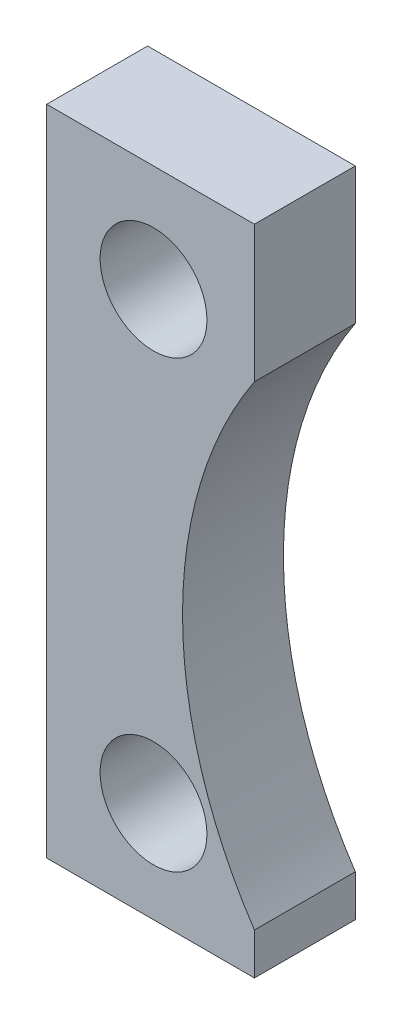
ISO-10303-21;
HEADER;
FILE_DESCRIPTION(('STEP AP214'),'2;1');
FILE_NAME('part.step','',(''),(''),'','','');
FILE_SCHEMA(('AUTOMOTIVE_DESIGN { 1 0 10303 214 1 1 1 1 }'));
ENDSEC;
DATA;
#1=APPLICATION_CONTEXT('core data for automotive mechanical design processes');
#2=APPLICATION_PROTOCOL_DEFINITION('international standard','automotive_design',2000,#1);
#3=PRODUCT_CONTEXT('',#1,'mechanical');
#4=PRODUCT('Part','Part','',(#3));
#5=PRODUCT_RELATED_PRODUCT_CATEGORY('part','',(#4));
#6=PRODUCT_DEFINITION_FORMATION('','',#4);
#7=PRODUCT_DEFINITION_CONTEXT('part definition',#1,'design');
#8=PRODUCT_DEFINITION('design','',#6,#7);
#9=PRODUCT_DEFINITION_SHAPE('','',#8);
#10=(LENGTH_UNIT() NAMED_UNIT(*) SI_UNIT(.MILLI.,.METRE.));
#11=(NAMED_UNIT(*) PLANE_ANGLE_UNIT() SI_UNIT($,.RADIAN.));
#12=(NAMED_UNIT(*) SI_UNIT($,.STERADIAN.) SOLID_ANGLE_UNIT());
#13=UNCERTAINTY_MEASURE_WITH_UNIT(LENGTH_MEASURE(1.E-05),#10,'distance_accuracy_value','');
#14=(GEOMETRIC_REPRESENTATION_CONTEXT(3) GLOBAL_UNCERTAINTY_ASSIGNED_CONTEXT((#13)) GLOBAL_UNIT_ASSIGNED_CONTEXT((#10,
#11,#12)) REPRESENTATION_CONTEXT('',''));
#15=CARTESIAN_POINT('',(0.,0.,0.));
#16=DIRECTION('',(0.,0.,1.));
#17=DIRECTION('',(1.,0.,0.));
#18=AXIS2_PLACEMENT_3D('',#15,#16,#17);
#19=CARTESIAN_POINT('',(0.,110.,8.5));
#20=DIRECTION('',(1.,0.,0.));
#21=DIRECTION('',(0.,1.,0.));
#22=AXIS2_PLACEMENT_3D('',#19,#20,#21);
#23=PLANE('',#22);
#24=DIRECTION('',(0.,-1.,0.));
#25=VECTOR('',#24,1.);
#26=CARTESIAN_POINT('',(0.,110.,-8.5));
#27=LINE('',#26,#25);
#28=CARTESIAN_POINT('',(0.,110.,-8.5));
#29=VERTEX_POINT('',#28);
#30=CARTESIAN_POINT('',(0.,0.,-8.5));
#31=VERTEX_POINT('',#30);
#32=EDGE_CURVE('E122',#29,#31,#27,.T.);
#33=ORIENTED_EDGE('',*,*,#32,.T.);
#34=DIRECTION('',(0.,0.,-1.));
#35=VECTOR('',#34,1.);
#36=CARTESIAN_POINT('',(0.,0.,8.5));
#37=LINE('',#36,#35);
#38=CARTESIAN_POINT('',(0.,0.,8.5));
#39=VERTEX_POINT('',#38);
#40=EDGE_CURVE('E11',#39,#31,#37,.T.);
#41=ORIENTED_EDGE('',*,*,#40,.F.);
#42=DIRECTION('',(0.,-1.,0.));
#43=VECTOR('',#42,1.);
#44=CARTESIAN_POINT('',(0.,110.,8.5));
#45=LINE('',#44,#43);
#46=CARTESIAN_POINT('',(0.,110.,8.5));
#47=VERTEX_POINT('',#46);
#48=EDGE_CURVE('E133',#47,#39,#45,.T.);
#49=ORIENTED_EDGE('',*,*,#48,.F.);
#50=DIRECTION('',(0.,0.,-1.));
#51=VECTOR('',#50,1.);
#52=CARTESIAN_POINT('',(0.,110.,8.5));
#53=LINE('',#52,#51);
#54=EDGE_CURVE('E118',#47,#29,#53,.T.);
#55=ORIENTED_EDGE('',*,*,#54,.T.);
#56=EDGE_LOOP('',(#33,#41,#49,#55));
#57=FACE_BOUND('',#56,.T.);
#58=ADVANCED_FACE('F38',(#57),#23,.F.);
#59=CARTESIAN_POINT('',(0.,0.,8.5));
#60=DIRECTION('',(0.,1.,0.));
#61=DIRECTION('',(0.,0.,1.));
#62=AXIS2_PLACEMENT_3D('',#59,#60,#61);
#63=PLANE('',#62);
#64=DIRECTION('',(1.,0.,0.));
#65=VECTOR('',#64,1.);
#66=CARTESIAN_POINT('',(0.,0.,-8.5));
#67=LINE('',#66,#65);
#68=CARTESIAN_POINT('',(35.,0.,-8.5));
#69=VERTEX_POINT('',#68);
#70=EDGE_CURVE('E125',#31,#69,#67,.T.);
#71=ORIENTED_EDGE('',*,*,#70,.T.);
#72=DIRECTION('',(0.,0.,-1.));
#73=VECTOR('',#72,1.);
#74=CARTESIAN_POINT('',(35.,0.,8.5));
#75=LINE('',#74,#73);
#76=CARTESIAN_POINT('',(35.,0.,8.5));
#77=VERTEX_POINT('',#76);
#78=EDGE_CURVE('E46',#77,#69,#75,.T.);
#79=ORIENTED_EDGE('',*,*,#78,.F.);
#80=DIRECTION('',(1.,0.,0.));
#81=VECTOR('',#80,1.);
#82=CARTESIAN_POINT('',(0.,0.,8.5));
#83=LINE('',#82,#81);
#84=EDGE_CURVE('E91',#39,#77,#83,.T.);
#85=ORIENTED_EDGE('',*,*,#84,.F.);
#86=ORIENTED_EDGE('',*,*,#40,.T.);
#87=EDGE_LOOP('',(#71,#79,#85,#86));
#88=FACE_BOUND('',#87,.T.);
#89=ADVANCED_FACE('F159',(#88),#63,.F.);
#90=CARTESIAN_POINT('',(35.,7.,8.5));
#91=DIRECTION('',(-1.,0.,0.));
#92=DIRECTION('',(0.,-1.,0.));
#93=AXIS2_PLACEMENT_3D('',#90,#91,#92);
#94=PLANE('',#93);
#95=DIRECTION('',(0.,1.,0.));
#96=VECTOR('',#95,1.);
#97=CARTESIAN_POINT('',(35.,7.,-8.5));
#98=LINE('',#97,#96);
#99=CARTESIAN_POINT('',(35.,7.00000000000003,-8.5));
#100=VERTEX_POINT('',#99);
#101=EDGE_CURVE('E128',#69,#100,#98,.T.);
#102=ORIENTED_EDGE('',*,*,#101,.T.);
#103=DIRECTION('',(0.,0.,-1.));
#104=VECTOR('',#103,1.);
#105=CARTESIAN_POINT('',(35.,7.00000000000003,8.5));
#106=LINE('',#105,#104);
#107=CARTESIAN_POINT('',(35.,7.00000000000003,8.5));
#108=VERTEX_POINT('',#107);
#109=EDGE_CURVE('E113',#108,#100,#106,.T.);
#110=ORIENTED_EDGE('',*,*,#109,.F.);
#111=DIRECTION('',(0.,1.,0.));
#112=VECTOR('',#111,1.);
#113=CARTESIAN_POINT('',(35.,7.,8.5));
#114=LINE('',#113,#112);
#115=EDGE_CURVE('E104',#77,#108,#114,.T.);
#116=ORIENTED_EDGE('',*,*,#115,.F.);
#117=ORIENTED_EDGE('',*,*,#78,.T.);
#118=EDGE_LOOP('',(#102,#110,#116,#117));
#119=FACE_BOUND('',#118,.T.);
#120=ADVANCED_FACE('F139',(#119),#94,.F.);
#121=CARTESIAN_POINT('',(95.0000000000002,47.,8.5));
#122=DIRECTION('',(0.,0.,-1.));
#123=DIRECTION('',(-1.,0.,0.));
#124=AXIS2_PLACEMENT_3D('',#121,#122,#123);
#125=CYLINDRICAL_SURFACE('',#124,72.11102550928);
#126=CARTESIAN_POINT('',(95.0000000000002,47.,-8.5));
#127=DIRECTION('',(0.,0.,-1.));
#128=DIRECTION('',(1.,0.,0.));
#129=AXIS2_PLACEMENT_3D('',#126,#127,#128);
#130=CIRCLE('',#129,72.11102550928);
#131=CARTESIAN_POINT('',(35.,87.,-8.5));
#132=VERTEX_POINT('',#131);
#133=EDGE_CURVE('E112',#100,#132,#130,.T.);
#134=ORIENTED_EDGE('',*,*,#133,.T.);
#135=DIRECTION('',(0.,0.,-1.));
#136=VECTOR('',#135,1.);
#137=CARTESIAN_POINT('',(35.,87.,8.5));
#138=LINE('',#137,#136);
#139=CARTESIAN_POINT('',(35.,87.,8.5));
#140=VERTEX_POINT('',#139);
#141=EDGE_CURVE('E109',#140,#132,#138,.T.);
#142=ORIENTED_EDGE('',*,*,#141,.F.);
#143=CARTESIAN_POINT('',(95.0000000000002,47.,8.5));
#144=DIRECTION('',(0.,0.,-1.));
#145=DIRECTION('',(1.,0.,0.));
#146=AXIS2_PLACEMENT_3D('',#143,#144,#145);
#147=CIRCLE('',#146,72.11102550928);
#148=EDGE_CURVE('E98',#108,#140,#147,.T.);
#149=ORIENTED_EDGE('',*,*,#148,.F.);
#150=ORIENTED_EDGE('',*,*,#109,.T.);
#151=EDGE_LOOP('',(#134,#142,#149,#150));
#152=FACE_BOUND('',#151,.T.);
#153=ADVANCED_FACE('F110',(#152),#125,.F.);
#154=CARTESIAN_POINT('',(35.,110.,8.5));
#155=DIRECTION('',(-1.,0.,0.));
#156=DIRECTION('',(0.,0.,1.));
#157=AXIS2_PLACEMENT_3D('',#154,#155,#156);
#158=PLANE('',#157);
#159=DIRECTION('',(0.,1.,0.));
#160=VECTOR('',#159,1.);
#161=CARTESIAN_POINT('',(35.,110.,-8.5));
#162=LINE('',#161,#160);
#163=CARTESIAN_POINT('',(35.,110.,-8.5));
#164=VERTEX_POINT('',#163);
#165=EDGE_CURVE('E77',#132,#164,#162,.T.);
#166=ORIENTED_EDGE('',*,*,#165,.T.);
#167=DIRECTION('',(0.,0.,-1.));
#168=VECTOR('',#167,1.);
#169=CARTESIAN_POINT('',(35.,110.,8.5));
#170=LINE('',#169,#168);
#171=CARTESIAN_POINT('',(35.,110.,8.5));
#172=VERTEX_POINT('',#171);
#173=EDGE_CURVE('E114',#172,#164,#170,.T.);
#174=ORIENTED_EDGE('',*,*,#173,.F.);
#175=DIRECTION('',(0.,1.,0.));
#176=VECTOR('',#175,1.);
#177=CARTESIAN_POINT('',(35.,110.,8.5));
#178=LINE('',#177,#176);
#179=EDGE_CURVE('E102',#140,#172,#178,.T.);
#180=ORIENTED_EDGE('',*,*,#179,.F.);
#181=ORIENTED_EDGE('',*,*,#141,.T.);
#182=EDGE_LOOP('',(#166,#174,#180,#181));
#183=FACE_BOUND('',#182,.T.);
#184=ADVANCED_FACE('F116',(#183),#158,.F.);
#185=CARTESIAN_POINT('',(0.,110.,8.5));
#186=DIRECTION('',(0.,-1.,0.));
#187=DIRECTION('',(0.,0.,-1.));
#188=AXIS2_PLACEMENT_3D('',#185,#186,#187);
#189=PLANE('',#188);
#190=DIRECTION('',(-1.,0.,0.));
#191=VECTOR('',#190,1.);
#192=CARTESIAN_POINT('',(0.,110.,-8.5));
#193=LINE('',#192,#191);
#194=EDGE_CURVE('E83',#164,#29,#193,.T.);
#195=ORIENTED_EDGE('',*,*,#194,.T.);
#196=ORIENTED_EDGE('',*,*,#54,.F.);
#197=DIRECTION('',(-1.,0.,0.));
#198=VECTOR('',#197,1.);
#199=CARTESIAN_POINT('',(0.,110.,8.5));
#200=LINE('',#199,#198);
#201=EDGE_CURVE('E54',#172,#47,#200,.T.);
#202=ORIENTED_EDGE('',*,*,#201,.F.);
#203=ORIENTED_EDGE('',*,*,#173,.T.);
#204=EDGE_LOOP('',(#195,#196,#202,#203));
#205=FACE_BOUND('',#204,.T.);
#206=ADVANCED_FACE('F146',(#205),#189,.F.);
#207=CARTESIAN_POINT('',(95.0000000000002,47.,8.5));
#208=DIRECTION('',(0.,0.,1.));
#209=DIRECTION('',(1.,0.,0.));
#210=AXIS2_PLACEMENT_3D('',#207,#208,#209);
#211=PLANE('',#210);
#212=CARTESIAN_POINT('',(18.0000000000002,92.,8.5));
#213=DIRECTION('',(0.,0.,1.));
#214=DIRECTION('',(1.,0.,0.));
#215=AXIS2_PLACEMENT_3D('',#212,#213,#214);
#216=CIRCLE('',#215,9.00000000000001);
#217=CARTESIAN_POINT('',(27.0000000000002,92.,8.5));
#218=VERTEX_POINT('',#217);
#219=EDGE_CURVE('E219',#218,#218,#216,.T.);
#220=ORIENTED_EDGE('',*,*,#219,.F.);
#221=EDGE_LOOP('',(#220));
#222=FACE_BOUND('',#221,.T.);
#223=CARTESIAN_POINT('',(18.0000000000002,17.,8.5));
#224=DIRECTION('',(0.,0.,1.));
#225=DIRECTION('',(1.,0.,0.));
#226=AXIS2_PLACEMENT_3D('',#223,#224,#225);
#227=CIRCLE('',#226,9.);
#228=CARTESIAN_POINT('',(27.0000000000002,17.,8.5));
#229=VERTEX_POINT('',#228);
#230=EDGE_CURVE('E224',#229,#229,#227,.T.);
#231=ORIENTED_EDGE('',*,*,#230,.F.);
#232=EDGE_LOOP('',(#231));
#233=FACE_BOUND('',#232,.T.);
#234=ORIENTED_EDGE('',*,*,#48,.T.);
#235=ORIENTED_EDGE('',*,*,#84,.T.);
#236=ORIENTED_EDGE('',*,*,#115,.T.);
#237=ORIENTED_EDGE('',*,*,#148,.T.);
#238=ORIENTED_EDGE('',*,*,#179,.T.);
#239=ORIENTED_EDGE('',*,*,#201,.T.);
#240=EDGE_LOOP('',(#234,#235,#236,#237,#238,#239));
#241=FACE_BOUND('',#240,.T.);
#242=ADVANCED_FACE('F100',(#222,#233,#241),#211,.T.);
#243=CARTESIAN_POINT('',(95.0000000000002,47.,-8.5));
#244=DIRECTION('',(0.,0.,1.));
#245=DIRECTION('',(1.,0.,0.));
#246=AXIS2_PLACEMENT_3D('',#243,#244,#245);
#247=PLANE('',#246);
#248=CARTESIAN_POINT('',(18.0000000000002,92.,-8.5));
#249=DIRECTION('',(0.,0.,1.));
#250=DIRECTION('',(1.,0.,0.));
#251=AXIS2_PLACEMENT_3D('',#248,#249,#250);
#252=CIRCLE('',#251,9.00000000000001);
#253=CARTESIAN_POINT('',(27.0000000000002,92.,-8.5));
#254=VERTEX_POINT('',#253);
#255=EDGE_CURVE('E126',#254,#254,#252,.T.);
#256=ORIENTED_EDGE('',*,*,#255,.T.);
#257=EDGE_LOOP('',(#256));
#258=FACE_BOUND('',#257,.T.);
#259=CARTESIAN_POINT('',(18.0000000000002,17.,-8.5));
#260=DIRECTION('',(0.,0.,1.));
#261=DIRECTION('',(1.,0.,0.));
#262=AXIS2_PLACEMENT_3D('',#259,#260,#261);
#263=CIRCLE('',#262,9.);
#264=CARTESIAN_POINT('',(27.0000000000002,17.,-8.5));
#265=VERTEX_POINT('',#264);
#266=EDGE_CURVE('E220',#265,#265,#263,.T.);
#267=ORIENTED_EDGE('',*,*,#266,.T.);
#268=EDGE_LOOP('',(#267));
#269=FACE_BOUND('',#268,.T.);
#270=ORIENTED_EDGE('',*,*,#32,.F.);
#271=ORIENTED_EDGE('',*,*,#194,.F.);
#272=ORIENTED_EDGE('',*,*,#165,.F.);
#273=ORIENTED_EDGE('',*,*,#133,.F.);
#274=ORIENTED_EDGE('',*,*,#101,.F.);
#275=ORIENTED_EDGE('',*,*,#70,.F.);
#276=EDGE_LOOP('',(#270,#271,#272,#273,#274,#275));
#277=FACE_BOUND('',#276,.T.);
#278=ADVANCED_FACE('F142',(#258,#269,#277),#247,.F.);
#279=CARTESIAN_POINT('',(18.0000000000002,17.,-8.5));
#280=DIRECTION('',(0.,0.,1.));
#281=DIRECTION('',(1.,0.,0.));
#282=AXIS2_PLACEMENT_3D('',#279,#280,#281);
#283=CYLINDRICAL_SURFACE('',#282,9.);
#284=ORIENTED_EDGE('',*,*,#266,.F.);
#285=EDGE_LOOP('',(#284));
#286=FACE_BOUND('',#285,.T.);
#287=ORIENTED_EDGE('',*,*,#230,.T.);
#288=EDGE_LOOP('',(#287));
#289=FACE_BOUND('',#288,.T.);
#290=ADVANCED_FACE('F192',(#286,#289),#283,.F.);
#291=CARTESIAN_POINT('',(18.0000000000002,92.,-8.5));
#292=DIRECTION('',(0.,0.,1.));
#293=DIRECTION('',(1.,0.,0.));
#294=AXIS2_PLACEMENT_3D('',#291,#292,#293);
#295=CYLINDRICAL_SURFACE('',#294,9.00000000000001);
#296=ORIENTED_EDGE('',*,*,#255,.F.);
#297=EDGE_LOOP('',(#296));
#298=FACE_BOUND('',#297,.T.);
#299=ORIENTED_EDGE('',*,*,#219,.T.);
#300=EDGE_LOOP('',(#299));
#301=FACE_BOUND('',#300,.T.);
#302=ADVANCED_FACE('F200',(#298,#301),#295,.F.);
#303=CLOSED_SHELL('',(#58,#89,#120,#153,#184,#206,#242,#278,#290,#302));
#304=MANIFOLD_SOLID_BREP('B2',#303);
#305=ADVANCED_BREP_SHAPE_REPRESENTATION('',(#18,#304),#14);
#306=SHAPE_DEFINITION_REPRESENTATION(#9,#305);
ENDSEC;
END-ISO-10303-21;
